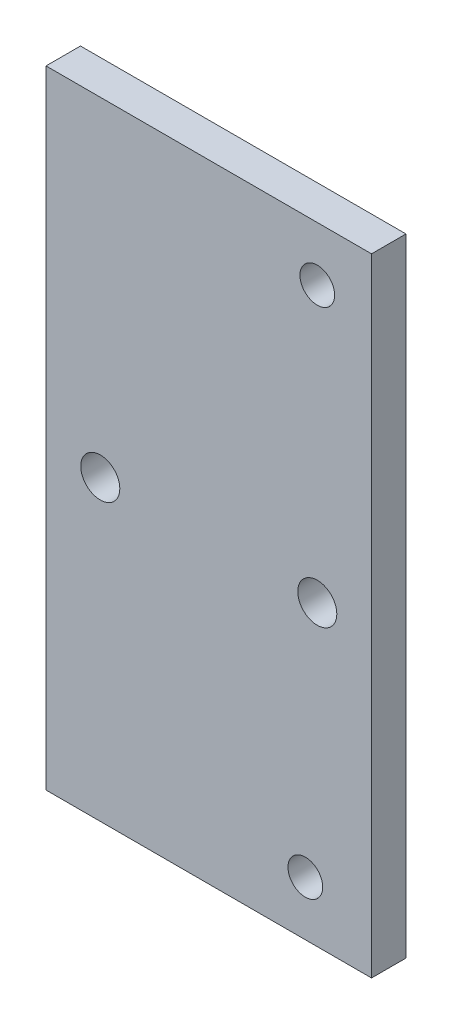
ISO-10303-21;
HEADER;
FILE_DESCRIPTION(('STEP AP214'),'2;1');
FILE_NAME('part.step','',(''),(''),'','','');
FILE_SCHEMA(('AUTOMOTIVE_DESIGN { 1 0 10303 214 1 1 1 1 }'));
ENDSEC;
DATA;
#1=APPLICATION_CONTEXT('core data for automotive mechanical design processes');
#2=APPLICATION_PROTOCOL_DEFINITION('international standard','automotive_design',2000,#1);
#3=PRODUCT_CONTEXT('',#1,'mechanical');
#4=PRODUCT('Part','Part','',(#3));
#5=PRODUCT_RELATED_PRODUCT_CATEGORY('part','',(#4));
#6=PRODUCT_DEFINITION_FORMATION('','',#4);
#7=PRODUCT_DEFINITION_CONTEXT('part definition',#1,'design');
#8=PRODUCT_DEFINITION('design','',#6,#7);
#9=PRODUCT_DEFINITION_SHAPE('','',#8);
#10=(LENGTH_UNIT() NAMED_UNIT(*) SI_UNIT(.MILLI.,.METRE.));
#11=(NAMED_UNIT(*) PLANE_ANGLE_UNIT() SI_UNIT($,.RADIAN.));
#12=(NAMED_UNIT(*) SI_UNIT($,.STERADIAN.) SOLID_ANGLE_UNIT());
#13=UNCERTAINTY_MEASURE_WITH_UNIT(LENGTH_MEASURE(1.E-05),#10,'distance_accuracy_value','');
#14=(GEOMETRIC_REPRESENTATION_CONTEXT(3) GLOBAL_UNCERTAINTY_ASSIGNED_CONTEXT((#13)) GLOBAL_UNIT_ASSIGNED_CONTEXT((#10,
#11,#12)) REPRESENTATION_CONTEXT('',''));
#15=CARTESIAN_POINT('',(0.,0.,0.));
#16=DIRECTION('',(0.,0.,1.));
#17=DIRECTION('',(1.,0.,0.));
#18=AXIS2_PLACEMENT_3D('',#15,#16,#17);
#19=CARTESIAN_POINT('',(0.,0.,3.175));
#20=DIRECTION('',(0.,0.,-1.));
#21=DIRECTION('',(-1.,0.,0.));
#22=AXIS2_PLACEMENT_3D('',#19,#20,#21);
#23=PLANE('',#22);
#24=DIRECTION('',(0.,1.,0.));
#25=VECTOR('',#24,1.);
#26=CARTESIAN_POINT('',(127.736428571428,30.3482142857143,3.175));
#27=LINE('',#26,#25);
#28=CARTESIAN_POINT('',(127.736428571428,-27.4517857142857,3.175));
#29=VERTEX_POINT('',#28);
#30=CARTESIAN_POINT('',(127.736428571428,30.3482142857143,3.175));
#31=VERTEX_POINT('',#30);
#32=EDGE_CURVE('E88',#29,#31,#27,.T.);
#33=ORIENTED_EDGE('',*,*,#32,.T.);
#34=DIRECTION('',(-1.,0.,0.));
#35=VECTOR('',#34,1.);
#36=CARTESIAN_POINT('',(127.736428571428,30.3482142857143,3.175));
#37=LINE('',#36,#35);
#38=CARTESIAN_POINT('',(97.7364285714282,30.3482142857143,3.175));
#39=VERTEX_POINT('',#38);
#40=EDGE_CURVE('E83',#31,#39,#37,.T.);
#41=ORIENTED_EDGE('',*,*,#40,.T.);
#42=DIRECTION('',(0.,-1.,0.));
#43=VECTOR('',#42,1.);
#44=CARTESIAN_POINT('',(97.7364285714282,30.3482142857143,3.175));
#45=LINE('',#44,#43);
#46=CARTESIAN_POINT('',(97.7364285714282,-27.4517857142857,3.175));
#47=VERTEX_POINT('',#46);
#48=EDGE_CURVE('E86',#39,#47,#45,.T.);
#49=ORIENTED_EDGE('',*,*,#48,.T.);
#50=DIRECTION('',(1.,0.,0.));
#51=VECTOR('',#50,1.);
#52=CARTESIAN_POINT('',(127.736428571428,-27.4517857142857,3.175));
#53=LINE('',#52,#51);
#54=EDGE_CURVE('E53',#47,#29,#53,.T.);
#55=ORIENTED_EDGE('',*,*,#54,.T.);
#56=EDGE_LOOP('',(#33,#41,#49,#55));
#57=FACE_BOUND('',#56,.T.);
#58=CARTESIAN_POINT('',(121.636428571428,-22.4517857142857,3.175));
#59=DIRECTION('',(0.,0.,1.));
#60=DIRECTION('',(1.,0.,0.));
#61=AXIS2_PLACEMENT_3D('',#58,#59,#60);
#62=CIRCLE('',#61,1.6);
#63=CARTESIAN_POINT('',(123.236428571428,-22.4517857142857,3.175));
#64=VERTEX_POINT('',#63);
#65=EDGE_CURVE('E114',#64,#64,#62,.T.);
#66=ORIENTED_EDGE('',*,*,#65,.F.);
#67=EDGE_LOOP('',(#66));
#68=FACE_BOUND('',#67,.T.);
#69=CARTESIAN_POINT('',(122.736428571428,25.3482142857143,3.175));
#70=DIRECTION('',(0.,0.,1.));
#71=DIRECTION('',(1.,0.,0.));
#72=AXIS2_PLACEMENT_3D('',#69,#70,#71);
#73=CIRCLE('',#72,1.6);
#74=CARTESIAN_POINT('',(124.336428571428,25.3482142857143,3.175));
#75=VERTEX_POINT('',#74);
#76=EDGE_CURVE('E124',#75,#75,#73,.T.);
#77=ORIENTED_EDGE('',*,*,#76,.F.);
#78=EDGE_LOOP('',(#77));
#79=FACE_BOUND('',#78,.T.);
#80=CARTESIAN_POINT('',(102.736428571428,0.,3.175));
#81=DIRECTION('',(0.,0.,1.));
#82=DIRECTION('',(1.,0.,0.));
#83=AXIS2_PLACEMENT_3D('',#80,#81,#82);
#84=CIRCLE('',#83,1.79999999999999);
#85=CARTESIAN_POINT('',(104.536428571428,0.,3.175));
#86=VERTEX_POINT('',#85);
#87=EDGE_CURVE('E239',#86,#86,#84,.T.);
#88=ORIENTED_EDGE('',*,*,#87,.F.);
#89=EDGE_LOOP('',(#88));
#90=FACE_BOUND('',#89,.T.);
#91=CARTESIAN_POINT('',(122.736428571428,0.,3.175));
#92=DIRECTION('',(0.,0.,1.));
#93=DIRECTION('',(1.,0.,0.));
#94=AXIS2_PLACEMENT_3D('',#91,#92,#93);
#95=CIRCLE('',#94,1.80000000000001);
#96=CARTESIAN_POINT('',(124.536428571428,0.,3.175));
#97=VERTEX_POINT('',#96);
#98=EDGE_CURVE('E229',#97,#97,#95,.T.);
#99=ORIENTED_EDGE('',*,*,#98,.F.);
#100=EDGE_LOOP('',(#99));
#101=FACE_BOUND('',#100,.T.);
#102=ADVANCED_FACE('F36',(#57,#68,#79,#90,#101),#23,.F.);
#103=CARTESIAN_POINT('',(0.,0.,0.));
#104=DIRECTION('',(0.,0.,-1.));
#105=DIRECTION('',(-1.,0.,0.));
#106=AXIS2_PLACEMENT_3D('',#103,#104,#105);
#107=PLANE('',#106);
#108=CARTESIAN_POINT('',(102.736428571428,0.,0.));
#109=DIRECTION('',(0.,0.,1.));
#110=DIRECTION('',(1.,0.,0.));
#111=AXIS2_PLACEMENT_3D('',#108,#109,#110);
#112=CIRCLE('',#111,1.79999999999999);
#113=CARTESIAN_POINT('',(104.536428571428,0.,0.));
#114=VERTEX_POINT('',#113);
#115=EDGE_CURVE('E236',#114,#114,#112,.T.);
#116=ORIENTED_EDGE('',*,*,#115,.T.);
#117=EDGE_LOOP('',(#116));
#118=FACE_BOUND('',#117,.T.);
#119=CARTESIAN_POINT('',(121.636428571428,-22.4517857142857,0.));
#120=DIRECTION('',(0.,0.,1.));
#121=DIRECTION('',(1.,0.,0.));
#122=AXIS2_PLACEMENT_3D('',#119,#120,#121);
#123=CIRCLE('',#122,1.6);
#124=CARTESIAN_POINT('',(123.236428571428,-22.4517857142857,0.));
#125=VERTEX_POINT('',#124);
#126=EDGE_CURVE('E121',#125,#125,#123,.T.);
#127=ORIENTED_EDGE('',*,*,#126,.T.);
#128=EDGE_LOOP('',(#127));
#129=FACE_BOUND('',#128,.T.);
#130=DIRECTION('',(0.,1.,0.));
#131=VECTOR('',#130,1.);
#132=CARTESIAN_POINT('',(127.736428571428,30.3482142857143,0.));
#133=LINE('',#132,#131);
#134=CARTESIAN_POINT('',(127.736428571428,-27.4517857142857,0.));
#135=VERTEX_POINT('',#134);
#136=CARTESIAN_POINT('',(127.736428571428,30.3482142857143,0.));
#137=VERTEX_POINT('',#136);
#138=EDGE_CURVE('E120',#135,#137,#133,.T.);
#139=ORIENTED_EDGE('',*,*,#138,.F.);
#140=DIRECTION('',(1.,0.,0.));
#141=VECTOR('',#140,1.);
#142=CARTESIAN_POINT('',(127.736428571428,-27.4517857142857,0.));
#143=LINE('',#142,#141);
#144=CARTESIAN_POINT('',(97.7364285714282,-27.4517857142857,0.));
#145=VERTEX_POINT('',#144);
#146=EDGE_CURVE('E76',#145,#135,#143,.T.);
#147=ORIENTED_EDGE('',*,*,#146,.F.);
#148=DIRECTION('',(0.,-1.,0.));
#149=VECTOR('',#148,1.);
#150=CARTESIAN_POINT('',(97.7364285714282,30.3482142857143,0.));
#151=LINE('',#150,#149);
#152=CARTESIAN_POINT('',(97.7364285714282,30.3482142857143,0.));
#153=VERTEX_POINT('',#152);
#154=EDGE_CURVE('E70',#153,#145,#151,.T.);
#155=ORIENTED_EDGE('',*,*,#154,.F.);
#156=DIRECTION('',(-1.,0.,0.));
#157=VECTOR('',#156,1.);
#158=CARTESIAN_POINT('',(127.736428571428,30.3482142857143,0.));
#159=LINE('',#158,#157);
#160=EDGE_CURVE('E93',#137,#153,#159,.T.);
#161=ORIENTED_EDGE('',*,*,#160,.F.);
#162=EDGE_LOOP('',(#139,#147,#155,#161));
#163=FACE_BOUND('',#162,.T.);
#164=CARTESIAN_POINT('',(122.736428571428,25.3482142857143,0.));
#165=DIRECTION('',(0.,0.,1.));
#166=DIRECTION('',(1.,0.,0.));
#167=AXIS2_PLACEMENT_3D('',#164,#165,#166);
#168=CIRCLE('',#167,1.6);
#169=CARTESIAN_POINT('',(124.336428571428,25.3482142857143,0.));
#170=VERTEX_POINT('',#169);
#171=EDGE_CURVE('E122',#170,#170,#168,.T.);
#172=ORIENTED_EDGE('',*,*,#171,.T.);
#173=EDGE_LOOP('',(#172));
#174=FACE_BOUND('',#173,.T.);
#175=CARTESIAN_POINT('',(122.736428571428,0.,0.));
#176=DIRECTION('',(0.,0.,1.));
#177=DIRECTION('',(1.,0.,0.));
#178=AXIS2_PLACEMENT_3D('',#175,#176,#177);
#179=CIRCLE('',#178,1.80000000000001);
#180=CARTESIAN_POINT('',(124.536428571428,0.,0.));
#181=VERTEX_POINT('',#180);
#182=EDGE_CURVE('E232',#181,#181,#179,.T.);
#183=ORIENTED_EDGE('',*,*,#182,.T.);
#184=EDGE_LOOP('',(#183));
#185=FACE_BOUND('',#184,.T.);
#186=ADVANCED_FACE('F135',(#118,#129,#163,#174,#185),#107,.T.);
#187=CARTESIAN_POINT('',(127.736428571428,30.3482142857143,3.175));
#188=DIRECTION('',(-1.,0.,0.));
#189=DIRECTION('',(0.,0.,1.));
#190=AXIS2_PLACEMENT_3D('',#187,#188,#189);
#191=PLANE('',#190);
#192=ORIENTED_EDGE('',*,*,#138,.T.);
#193=DIRECTION('',(0.,0.,-1.));
#194=VECTOR('',#193,1.);
#195=CARTESIAN_POINT('',(127.736428571428,30.3482142857143,3.175));
#196=LINE('',#195,#194);
#197=EDGE_CURVE('E12',#31,#137,#196,.T.);
#198=ORIENTED_EDGE('',*,*,#197,.F.);
#199=ORIENTED_EDGE('',*,*,#32,.F.);
#200=DIRECTION('',(0.,0.,-1.));
#201=VECTOR('',#200,1.);
#202=CARTESIAN_POINT('',(127.736428571428,-27.4517857142857,3.175));
#203=LINE('',#202,#201);
#204=EDGE_CURVE('E99',#29,#135,#203,.T.);
#205=ORIENTED_EDGE('',*,*,#204,.T.);
#206=EDGE_LOOP('',(#192,#198,#199,#205));
#207=FACE_BOUND('',#206,.T.);
#208=ADVANCED_FACE('F38',(#207),#191,.F.);
#209=CARTESIAN_POINT('',(127.736428571428,30.3482142857143,3.175));
#210=DIRECTION('',(0.,-1.,0.));
#211=DIRECTION('',(1.,0.,0.));
#212=AXIS2_PLACEMENT_3D('',#209,#210,#211);
#213=PLANE('',#212);
#214=ORIENTED_EDGE('',*,*,#160,.T.);
#215=DIRECTION('',(0.,0.,-1.));
#216=VECTOR('',#215,1.);
#217=CARTESIAN_POINT('',(97.7364285714282,30.3482142857143,3.175));
#218=LINE('',#217,#216);
#219=EDGE_CURVE('E45',#39,#153,#218,.T.);
#220=ORIENTED_EDGE('',*,*,#219,.F.);
#221=ORIENTED_EDGE('',*,*,#40,.F.);
#222=ORIENTED_EDGE('',*,*,#197,.T.);
#223=EDGE_LOOP('',(#214,#220,#221,#222));
#224=FACE_BOUND('',#223,.T.);
#225=ADVANCED_FACE('F92',(#224),#213,.F.);
#226=CARTESIAN_POINT('',(97.7364285714282,30.3482142857143,3.175));
#227=DIRECTION('',(1.,0.,0.));
#228=DIRECTION('',(0.,0.,-1.));
#229=AXIS2_PLACEMENT_3D('',#226,#227,#228);
#230=PLANE('',#229);
#231=ORIENTED_EDGE('',*,*,#154,.T.);
#232=DIRECTION('',(0.,0.,-1.));
#233=VECTOR('',#232,1.);
#234=CARTESIAN_POINT('',(97.7364285714282,-27.4517857142857,3.175));
#235=LINE('',#234,#233);
#236=EDGE_CURVE('E94',#47,#145,#235,.T.);
#237=ORIENTED_EDGE('',*,*,#236,.F.);
#238=ORIENTED_EDGE('',*,*,#48,.F.);
#239=ORIENTED_EDGE('',*,*,#219,.T.);
#240=EDGE_LOOP('',(#231,#237,#238,#239));
#241=FACE_BOUND('',#240,.T.);
#242=ADVANCED_FACE('F95',(#241),#230,.F.);
#243=CARTESIAN_POINT('',(127.736428571428,-27.4517857142857,3.175));
#244=DIRECTION('',(0.,1.,0.));
#245=DIRECTION('',(-1.,0.,0.));
#246=AXIS2_PLACEMENT_3D('',#243,#244,#245);
#247=PLANE('',#246);
#248=ORIENTED_EDGE('',*,*,#146,.T.);
#249=ORIENTED_EDGE('',*,*,#204,.F.);
#250=ORIENTED_EDGE('',*,*,#54,.F.);
#251=ORIENTED_EDGE('',*,*,#236,.T.);
#252=EDGE_LOOP('',(#248,#249,#250,#251));
#253=FACE_BOUND('',#252,.T.);
#254=ADVANCED_FACE('F132',(#253),#247,.F.);
#255=CARTESIAN_POINT('',(121.636428571428,-22.4517857142857,3.175));
#256=DIRECTION('',(0.,0.,-1.));
#257=DIRECTION('',(-1.,0.,0.));
#258=AXIS2_PLACEMENT_3D('',#255,#256,#257);
#259=CYLINDRICAL_SURFACE('',#258,1.6);
#260=ORIENTED_EDGE('',*,*,#65,.T.);
#261=EDGE_LOOP('',(#260));
#262=FACE_BOUND('',#261,.T.);
#263=ORIENTED_EDGE('',*,*,#126,.F.);
#264=EDGE_LOOP('',(#263));
#265=FACE_BOUND('',#264,.T.);
#266=ADVANCED_FACE('F151',(#262,#265),#259,.F.);
#267=CARTESIAN_POINT('',(122.736428571428,25.3482142857143,3.175));
#268=DIRECTION('',(0.,0.,-1.));
#269=DIRECTION('',(-1.,0.,0.));
#270=AXIS2_PLACEMENT_3D('',#267,#268,#269);
#271=CYLINDRICAL_SURFACE('',#270,1.6);
#272=ORIENTED_EDGE('',*,*,#76,.T.);
#273=EDGE_LOOP('',(#272));
#274=FACE_BOUND('',#273,.T.);
#275=ORIENTED_EDGE('',*,*,#171,.F.);
#276=EDGE_LOOP('',(#275));
#277=FACE_BOUND('',#276,.T.);
#278=ADVANCED_FACE('F171',(#274,#277),#271,.F.);
#279=CARTESIAN_POINT('',(102.736428571428,0.,3.175));
#280=DIRECTION('',(0.,0.,-1.));
#281=DIRECTION('',(-1.,0.,0.));
#282=AXIS2_PLACEMENT_3D('',#279,#280,#281);
#283=CYLINDRICAL_SURFACE('',#282,1.79999999999999);
#284=ORIENTED_EDGE('',*,*,#87,.T.);
#285=EDGE_LOOP('',(#284));
#286=FACE_BOUND('',#285,.T.);
#287=ORIENTED_EDGE('',*,*,#115,.F.);
#288=EDGE_LOOP('',(#287));
#289=FACE_BOUND('',#288,.T.);
#290=ADVANCED_FACE('F178',(#286,#289),#283,.F.);
#291=CARTESIAN_POINT('',(122.736428571428,0.,3.175));
#292=DIRECTION('',(0.,0.,-1.));
#293=DIRECTION('',(-1.,0.,0.));
#294=AXIS2_PLACEMENT_3D('',#291,#292,#293);
#295=CYLINDRICAL_SURFACE('',#294,1.80000000000001);
#296=ORIENTED_EDGE('',*,*,#98,.T.);
#297=EDGE_LOOP('',(#296));
#298=FACE_BOUND('',#297,.T.);
#299=ORIENTED_EDGE('',*,*,#182,.F.);
#300=EDGE_LOOP('',(#299));
#301=FACE_BOUND('',#300,.T.);
#302=ADVANCED_FACE('F185',(#298,#301),#295,.F.);
#303=CLOSED_SHELL('',(#102,#186,#208,#225,#242,#254,#266,#278,#290,#302));
#304=MANIFOLD_SOLID_BREP('B2',#303);
#305=ADVANCED_BREP_SHAPE_REPRESENTATION('',(#18,#304),#14);
#306=SHAPE_DEFINITION_REPRESENTATION(#9,#305);
ENDSEC;
END-ISO-10303-21;
